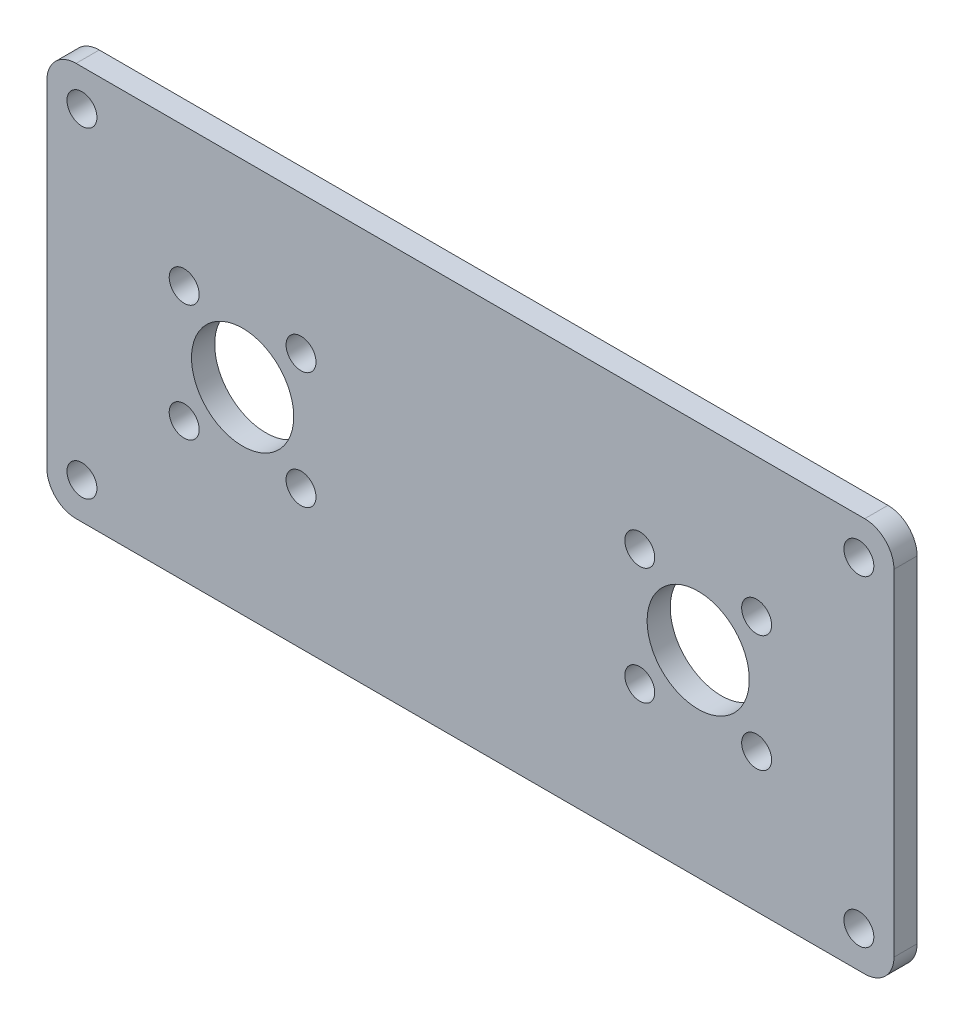
ISO-10303-21;
HEADER;
FILE_DESCRIPTION(('STEP AP214'),'2;1');
FILE_NAME('part.step','',(''),(''),'','','');
FILE_SCHEMA(('AUTOMOTIVE_DESIGN { 1 0 10303 214 1 1 1 1 }'));
ENDSEC;
DATA;
#1=APPLICATION_CONTEXT('core data for automotive mechanical design processes');
#2=APPLICATION_PROTOCOL_DEFINITION('international standard','automotive_design',2000,#1);
#3=PRODUCT_CONTEXT('',#1,'mechanical');
#4=PRODUCT('Part','Part','',(#3));
#5=PRODUCT_RELATED_PRODUCT_CATEGORY('part','',(#4));
#6=PRODUCT_DEFINITION_FORMATION('','',#4);
#7=PRODUCT_DEFINITION_CONTEXT('part definition',#1,'design');
#8=PRODUCT_DEFINITION('design','',#6,#7);
#9=PRODUCT_DEFINITION_SHAPE('','',#8);
#10=(LENGTH_UNIT() NAMED_UNIT(*) SI_UNIT(.MILLI.,.METRE.));
#11=(NAMED_UNIT(*) PLANE_ANGLE_UNIT() SI_UNIT($,.RADIAN.));
#12=(NAMED_UNIT(*) SI_UNIT($,.STERADIAN.) SOLID_ANGLE_UNIT());
#13=UNCERTAINTY_MEASURE_WITH_UNIT(LENGTH_MEASURE(1.E-05),#10,'distance_accuracy_value','');
#14=(GEOMETRIC_REPRESENTATION_CONTEXT(3) GLOBAL_UNCERTAINTY_ASSIGNED_CONTEXT((#13)) GLOBAL_UNIT_ASSIGNED_CONTEXT((#10,
#11,#12)) REPRESENTATION_CONTEXT('',''));
#15=CARTESIAN_POINT('',(0.,0.,0.));
#16=DIRECTION('',(0.,0.,1.));
#17=DIRECTION('',(1.,0.,0.));
#18=AXIS2_PLACEMENT_3D('',#15,#16,#17);
#19=CARTESIAN_POINT('',(0.,0.,3.175));
#20=DIRECTION('',(0.,0.,1.));
#21=DIRECTION('',(1.,0.,0.));
#22=AXIS2_PLACEMENT_3D('',#19,#20,#21);
#23=PLANE('',#22);
#24=CARTESIAN_POINT('',(31.195,0.,3.175));
#25=DIRECTION('',(0.,0.,1.));
#26=DIRECTION('',(-1.,0.,0.));
#27=AXIS2_PLACEMENT_3D('',#24,#25,#26);
#28=CIRCLE('',#27,7.);
#29=CARTESIAN_POINT('',(24.195,0.,3.175));
#30=VERTEX_POINT('',#29);
#31=EDGE_CURVE('E246',#30,#30,#28,.T.);
#32=ORIENTED_EDGE('',*,*,#31,.F.);
#33=EDGE_LOOP('',(#32));
#34=FACE_BOUND('',#33,.T.);
#35=CARTESIAN_POINT('',(39.1950000000001,8.00000000000001,3.175));
#36=DIRECTION('',(0.,0.,1.));
#37=DIRECTION('',(-1.,0.,0.));
#38=AXIS2_PLACEMENT_3D('',#35,#36,#37);
#39=CIRCLE('',#38,2.05);
#40=CARTESIAN_POINT('',(37.145,8.00000000000001,3.175));
#41=VERTEX_POINT('',#40);
#42=EDGE_CURVE('E234',#41,#41,#39,.T.);
#43=ORIENTED_EDGE('',*,*,#42,.F.);
#44=EDGE_LOOP('',(#43));
#45=FACE_BOUND('',#44,.T.);
#46=CARTESIAN_POINT('',(-31.195,0.,3.175));
#47=DIRECTION('',(0.,0.,1.));
#48=DIRECTION('',(1.,0.,0.));
#49=AXIS2_PLACEMENT_3D('',#46,#47,#48);
#50=CIRCLE('',#49,7.);
#51=CARTESIAN_POINT('',(-24.195,0.,3.175));
#52=VERTEX_POINT('',#51);
#53=EDGE_CURVE('E222',#52,#52,#50,.T.);
#54=ORIENTED_EDGE('',*,*,#53,.F.);
#55=EDGE_LOOP('',(#54));
#56=FACE_BOUND('',#55,.T.);
#57=CARTESIAN_POINT('',(-23.195,-8.00000000000001,3.175));
#58=DIRECTION('',(0.,0.,1.));
#59=DIRECTION('',(1.,0.,0.));
#60=AXIS2_PLACEMENT_3D('',#57,#58,#59);
#61=CIRCLE('',#60,2.05);
#62=CARTESIAN_POINT('',(-21.145,-8.00000000000001,3.175));
#63=VERTEX_POINT('',#62);
#64=EDGE_CURVE('E210',#63,#63,#61,.T.);
#65=ORIENTED_EDGE('',*,*,#64,.F.);
#66=EDGE_LOOP('',(#65));
#67=FACE_BOUND('',#66,.T.);
#68=CARTESIAN_POINT('',(-39.195,7.99999999999999,3.175));
#69=DIRECTION('',(0.,0.,1.));
#70=DIRECTION('',(1.,0.,0.));
#71=AXIS2_PLACEMENT_3D('',#68,#69,#70);
#72=CIRCLE('',#71,2.05);
#73=CARTESIAN_POINT('',(-37.145,7.99999999999999,3.175));
#74=VERTEX_POINT('',#73);
#75=EDGE_CURVE('E198',#74,#74,#72,.T.);
#76=ORIENTED_EDGE('',*,*,#75,.F.);
#77=EDGE_LOOP('',(#76));
#78=FACE_BOUND('',#77,.T.);
#79=CARTESIAN_POINT('',(53.195,-22.,3.175));
#80=DIRECTION('',(0.,0.,1.));
#81=DIRECTION('',(1.,0.,0.));
#82=AXIS2_PLACEMENT_3D('',#79,#80,#81);
#83=CIRCLE('',#82,2.05);
#84=CARTESIAN_POINT('',(55.245,-22.,3.175));
#85=VERTEX_POINT('',#84);
#86=EDGE_CURVE('E186',#85,#85,#83,.T.);
#87=ORIENTED_EDGE('',*,*,#86,.F.);
#88=EDGE_LOOP('',(#87));
#89=FACE_BOUND('',#88,.T.);
#90=CARTESIAN_POINT('',(-53.195,22.,3.175));
#91=DIRECTION('',(0.,0.,1.));
#92=DIRECTION('',(1.,0.,0.));
#93=AXIS2_PLACEMENT_3D('',#90,#91,#92);
#94=CIRCLE('',#93,2.04999999999999);
#95=CARTESIAN_POINT('',(-51.145,22.,3.175));
#96=VERTEX_POINT('',#95);
#97=EDGE_CURVE('E132',#96,#96,#94,.T.);
#98=ORIENTED_EDGE('',*,*,#97,.F.);
#99=EDGE_LOOP('',(#98));
#100=FACE_BOUND('',#99,.T.);
#101=DIRECTION('',(0.,-1.,0.));
#102=VECTOR('',#101,1.);
#103=CARTESIAN_POINT('',(-58.,-27.,3.175));
#104=LINE('',#103,#102);
#105=CARTESIAN_POINT('',(-58.,23.,3.175));
#106=VERTEX_POINT('',#105);
#107=CARTESIAN_POINT('',(-58.,-23.,3.175));
#108=VERTEX_POINT('',#107);
#109=EDGE_CURVE('E137',#106,#108,#104,.T.);
#110=ORIENTED_EDGE('',*,*,#109,.T.);
#111=CARTESIAN_POINT('',(-54.,-23.,3.175));
#112=DIRECTION('',(0.,0.,1.));
#113=DIRECTION('',(1.,0.,0.));
#114=AXIS2_PLACEMENT_3D('',#111,#112,#113);
#115=CIRCLE('',#114,4.);
#116=CARTESIAN_POINT('',(-54.,-27.,3.175));
#117=VERTEX_POINT('',#116);
#118=EDGE_CURVE('E152',#108,#117,#115,.T.);
#119=ORIENTED_EDGE('',*,*,#118,.T.);
#120=DIRECTION('',(1.,0.,0.));
#121=VECTOR('',#120,1.);
#122=CARTESIAN_POINT('',(58.,-27.,3.175));
#123=LINE('',#122,#121);
#124=CARTESIAN_POINT('',(54.,-27.,3.175));
#125=VERTEX_POINT('',#124);
#126=EDGE_CURVE('E119',#117,#125,#123,.T.);
#127=ORIENTED_EDGE('',*,*,#126,.T.);
#128=CARTESIAN_POINT('',(54.,-23.,3.175));
#129=DIRECTION('',(0.,0.,1.));
#130=DIRECTION('',(1.,0.,0.));
#131=AXIS2_PLACEMENT_3D('',#128,#129,#130);
#132=CIRCLE('',#131,4.);
#133=CARTESIAN_POINT('',(58.,-23.,3.175));
#134=VERTEX_POINT('',#133);
#135=EDGE_CURVE('E150',#125,#134,#132,.T.);
#136=ORIENTED_EDGE('',*,*,#135,.T.);
#137=DIRECTION('',(0.,1.,0.));
#138=VECTOR('',#137,1.);
#139=CARTESIAN_POINT('',(58.,-27.,3.175));
#140=LINE('',#139,#138);
#141=CARTESIAN_POINT('',(58.,23.,3.175));
#142=VERTEX_POINT('',#141);
#143=EDGE_CURVE('E163',#134,#142,#140,.T.);
#144=ORIENTED_EDGE('',*,*,#143,.T.);
#145=CARTESIAN_POINT('',(54.,23.,3.175));
#146=DIRECTION('',(0.,0.,1.));
#147=DIRECTION('',(1.,0.,0.));
#148=AXIS2_PLACEMENT_3D('',#145,#146,#147);
#149=CIRCLE('',#148,4.);
#150=CARTESIAN_POINT('',(54.,27.,3.175));
#151=VERTEX_POINT('',#150);
#152=EDGE_CURVE('E54',#142,#151,#149,.T.);
#153=ORIENTED_EDGE('',*,*,#152,.T.);
#154=DIRECTION('',(-1.,0.,0.));
#155=VECTOR('',#154,1.);
#156=CARTESIAN_POINT('',(58.,27.,3.175));
#157=LINE('',#156,#155);
#158=CARTESIAN_POINT('',(-54.,27.,3.175));
#159=VERTEX_POINT('',#158);
#160=EDGE_CURVE('E138',#151,#159,#157,.T.);
#161=ORIENTED_EDGE('',*,*,#160,.T.);
#162=CARTESIAN_POINT('',(-54.,23.,3.175));
#163=DIRECTION('',(0.,0.,1.));
#164=DIRECTION('',(1.,0.,0.));
#165=AXIS2_PLACEMENT_3D('',#162,#163,#164);
#166=CIRCLE('',#165,4.);
#167=EDGE_CURVE('E147',#159,#106,#166,.T.);
#168=ORIENTED_EDGE('',*,*,#167,.T.);
#169=EDGE_LOOP('',(#110,#119,#127,#136,#144,#153,#161,#168));
#170=FACE_BOUND('',#169,.T.);
#171=CARTESIAN_POINT('',(53.195,22.,3.175));
#172=DIRECTION('',(0.,0.,1.));
#173=DIRECTION('',(1.,0.,0.));
#174=AXIS2_PLACEMENT_3D('',#171,#172,#173);
#175=CIRCLE('',#174,2.04999999999999);
#176=CARTESIAN_POINT('',(55.245,22.,3.175));
#177=VERTEX_POINT('',#176);
#178=EDGE_CURVE('E180',#177,#177,#175,.T.);
#179=ORIENTED_EDGE('',*,*,#178,.F.);
#180=EDGE_LOOP('',(#179));
#181=FACE_BOUND('',#180,.T.);
#182=CARTESIAN_POINT('',(-53.195,-22.,3.175));
#183=DIRECTION('',(0.,0.,1.));
#184=DIRECTION('',(1.,0.,0.));
#185=AXIS2_PLACEMENT_3D('',#182,#183,#184);
#186=CIRCLE('',#185,2.05);
#187=CARTESIAN_POINT('',(-51.145,-22.,3.175));
#188=VERTEX_POINT('',#187);
#189=EDGE_CURVE('E192',#188,#188,#186,.T.);
#190=ORIENTED_EDGE('',*,*,#189,.F.);
#191=EDGE_LOOP('',(#190));
#192=FACE_BOUND('',#191,.T.);
#193=CARTESIAN_POINT('',(-23.195,8.,3.175));
#194=DIRECTION('',(0.,0.,1.));
#195=DIRECTION('',(1.,0.,0.));
#196=AXIS2_PLACEMENT_3D('',#193,#194,#195);
#197=CIRCLE('',#196,2.05);
#198=CARTESIAN_POINT('',(-21.145,8.,3.175));
#199=VERTEX_POINT('',#198);
#200=EDGE_CURVE('E204',#199,#199,#197,.T.);
#201=ORIENTED_EDGE('',*,*,#200,.F.);
#202=EDGE_LOOP('',(#201));
#203=FACE_BOUND('',#202,.T.);
#204=CARTESIAN_POINT('',(-39.195,-8.00000000000001,3.175));
#205=DIRECTION('',(0.,0.,1.));
#206=DIRECTION('',(1.,0.,0.));
#207=AXIS2_PLACEMENT_3D('',#204,#205,#206);
#208=CIRCLE('',#207,2.05);
#209=CARTESIAN_POINT('',(-37.145,-8.00000000000001,3.175));
#210=VERTEX_POINT('',#209);
#211=EDGE_CURVE('E216',#210,#210,#208,.T.);
#212=ORIENTED_EDGE('',*,*,#211,.F.);
#213=EDGE_LOOP('',(#212));
#214=FACE_BOUND('',#213,.T.);
#215=CARTESIAN_POINT('',(39.195,-7.99999999999999,3.175));
#216=DIRECTION('',(0.,0.,1.));
#217=DIRECTION('',(-1.,0.,0.));
#218=AXIS2_PLACEMENT_3D('',#215,#216,#217);
#219=CIRCLE('',#218,2.05);
#220=CARTESIAN_POINT('',(37.145,-7.99999999999999,3.175));
#221=VERTEX_POINT('',#220);
#222=EDGE_CURVE('E228',#221,#221,#219,.T.);
#223=ORIENTED_EDGE('',*,*,#222,.F.);
#224=EDGE_LOOP('',(#223));
#225=FACE_BOUND('',#224,.T.);
#226=CARTESIAN_POINT('',(23.195,8.,3.175));
#227=DIRECTION('',(0.,0.,1.));
#228=DIRECTION('',(-1.,0.,0.));
#229=AXIS2_PLACEMENT_3D('',#226,#227,#228);
#230=CIRCLE('',#229,2.05);
#231=CARTESIAN_POINT('',(21.145,8.,3.175));
#232=VERTEX_POINT('',#231);
#233=EDGE_CURVE('E240',#232,#232,#230,.T.);
#234=ORIENTED_EDGE('',*,*,#233,.F.);
#235=EDGE_LOOP('',(#234));
#236=FACE_BOUND('',#235,.T.);
#237=CARTESIAN_POINT('',(23.195,-8.,3.175));
#238=DIRECTION('',(0.,0.,1.));
#239=DIRECTION('',(-1.,0.,0.));
#240=AXIS2_PLACEMENT_3D('',#237,#238,#239);
#241=CIRCLE('',#240,2.05);
#242=CARTESIAN_POINT('',(21.145,-8.,3.175));
#243=VERTEX_POINT('',#242);
#244=EDGE_CURVE('E252',#243,#243,#241,.T.);
#245=ORIENTED_EDGE('',*,*,#244,.F.);
#246=EDGE_LOOP('',(#245));
#247=FACE_BOUND('',#246,.T.);
#248=ADVANCED_FACE('F33',(#34,#45,#56,#67,#78,#89,#100,#170,#181,#192,#203,#214,#225,#236,#247),
#23,.T.);
#249=CARTESIAN_POINT('',(0.,0.,0.));
#250=DIRECTION('',(0.,0.,1.));
#251=DIRECTION('',(1.,0.,0.));
#252=AXIS2_PLACEMENT_3D('',#249,#250,#251);
#253=PLANE('',#252);
#254=DIRECTION('',(1.,0.,0.));
#255=VECTOR('',#254,1.);
#256=CARTESIAN_POINT('',(58.,-27.,0.));
#257=LINE('',#256,#255);
#258=CARTESIAN_POINT('',(-54.,-27.,0.));
#259=VERTEX_POINT('',#258);
#260=CARTESIAN_POINT('',(54.,-27.,0.));
#261=VERTEX_POINT('',#260);
#262=EDGE_CURVE('E116',#259,#261,#257,.T.);
#263=ORIENTED_EDGE('',*,*,#262,.F.);
#264=CARTESIAN_POINT('',(-54.,-23.,0.));
#265=DIRECTION('',(0.,0.,1.));
#266=DIRECTION('',(1.,0.,0.));
#267=AXIS2_PLACEMENT_3D('',#264,#265,#266);
#268=CIRCLE('',#267,4.);
#269=CARTESIAN_POINT('',(-58.,-23.,0.));
#270=VERTEX_POINT('',#269);
#271=EDGE_CURVE('E99',#259,#270,#268,.F.);
#272=ORIENTED_EDGE('',*,*,#271,.T.);
#273=DIRECTION('',(0.,-1.,0.));
#274=VECTOR('',#273,1.);
#275=CARTESIAN_POINT('',(-58.,-27.,0.));
#276=LINE('',#275,#274);
#277=CARTESIAN_POINT('',(-58.,23.,0.));
#278=VERTEX_POINT('',#277);
#279=EDGE_CURVE('E127',#278,#270,#276,.T.);
#280=ORIENTED_EDGE('',*,*,#279,.F.);
#281=CARTESIAN_POINT('',(-54.,23.,0.));
#282=DIRECTION('',(0.,0.,1.));
#283=DIRECTION('',(1.,0.,0.));
#284=AXIS2_PLACEMENT_3D('',#281,#282,#283);
#285=CIRCLE('',#284,4.);
#286=CARTESIAN_POINT('',(-54.,27.,0.));
#287=VERTEX_POINT('',#286);
#288=EDGE_CURVE('E120',#278,#287,#285,.F.);
#289=ORIENTED_EDGE('',*,*,#288,.T.);
#290=DIRECTION('',(-1.,0.,0.));
#291=VECTOR('',#290,1.);
#292=CARTESIAN_POINT('',(58.,27.,0.));
#293=LINE('',#292,#291);
#294=CARTESIAN_POINT('',(54.,27.,0.));
#295=VERTEX_POINT('',#294);
#296=EDGE_CURVE('E130',#295,#287,#293,.T.);
#297=ORIENTED_EDGE('',*,*,#296,.F.);
#298=CARTESIAN_POINT('',(54.,23.,0.));
#299=DIRECTION('',(0.,0.,1.));
#300=DIRECTION('',(1.,0.,0.));
#301=AXIS2_PLACEMENT_3D('',#298,#299,#300);
#302=CIRCLE('',#301,4.);
#303=CARTESIAN_POINT('',(58.,23.,0.));
#304=VERTEX_POINT('',#303);
#305=EDGE_CURVE('E141',#295,#304,#302,.F.);
#306=ORIENTED_EDGE('',*,*,#305,.T.);
#307=DIRECTION('',(0.,1.,0.));
#308=VECTOR('',#307,1.);
#309=CARTESIAN_POINT('',(58.,-27.,0.));
#310=LINE('',#309,#308);
#311=CARTESIAN_POINT('',(58.,-23.,0.));
#312=VERTEX_POINT('',#311);
#313=EDGE_CURVE('E126',#312,#304,#310,.T.);
#314=ORIENTED_EDGE('',*,*,#313,.F.);
#315=CARTESIAN_POINT('',(54.,-23.,0.));
#316=DIRECTION('',(0.,0.,1.));
#317=DIRECTION('',(1.,0.,0.));
#318=AXIS2_PLACEMENT_3D('',#315,#316,#317);
#319=CIRCLE('',#318,4.);
#320=EDGE_CURVE('E110',#312,#261,#319,.F.);
#321=ORIENTED_EDGE('',*,*,#320,.T.);
#322=EDGE_LOOP('',(#263,#272,#280,#289,#297,#306,#314,#321));
#323=FACE_BOUND('',#322,.T.);
#324=CARTESIAN_POINT('',(-53.195,22.,0.));
#325=DIRECTION('',(0.,0.,1.));
#326=DIRECTION('',(1.,0.,0.));
#327=AXIS2_PLACEMENT_3D('',#324,#325,#326);
#328=CIRCLE('',#327,2.04999999999999);
#329=CARTESIAN_POINT('',(-51.145,22.,0.));
#330=VERTEX_POINT('',#329);
#331=EDGE_CURVE('E177',#330,#330,#328,.T.);
#332=ORIENTED_EDGE('',*,*,#331,.T.);
#333=EDGE_LOOP('',(#332));
#334=FACE_BOUND('',#333,.T.);
#335=CARTESIAN_POINT('',(53.195,22.,0.));
#336=DIRECTION('',(0.,0.,1.));
#337=DIRECTION('',(1.,0.,0.));
#338=AXIS2_PLACEMENT_3D('',#335,#336,#337);
#339=CIRCLE('',#338,2.04999999999999);
#340=CARTESIAN_POINT('',(55.245,22.,0.));
#341=VERTEX_POINT('',#340);
#342=EDGE_CURVE('E183',#341,#341,#339,.T.);
#343=ORIENTED_EDGE('',*,*,#342,.T.);
#344=EDGE_LOOP('',(#343));
#345=FACE_BOUND('',#344,.T.);
#346=CARTESIAN_POINT('',(53.195,-22.,0.));
#347=DIRECTION('',(0.,0.,1.));
#348=DIRECTION('',(1.,0.,0.));
#349=AXIS2_PLACEMENT_3D('',#346,#347,#348);
#350=CIRCLE('',#349,2.05);
#351=CARTESIAN_POINT('',(55.245,-22.,0.));
#352=VERTEX_POINT('',#351);
#353=EDGE_CURVE('E189',#352,#352,#350,.T.);
#354=ORIENTED_EDGE('',*,*,#353,.T.);
#355=EDGE_LOOP('',(#354));
#356=FACE_BOUND('',#355,.T.);
#357=CARTESIAN_POINT('',(-53.195,-22.,0.));
#358=DIRECTION('',(0.,0.,1.));
#359=DIRECTION('',(1.,0.,0.));
#360=AXIS2_PLACEMENT_3D('',#357,#358,#359);
#361=CIRCLE('',#360,2.05);
#362=CARTESIAN_POINT('',(-51.145,-22.,0.));
#363=VERTEX_POINT('',#362);
#364=EDGE_CURVE('E195',#363,#363,#361,.T.);
#365=ORIENTED_EDGE('',*,*,#364,.T.);
#366=EDGE_LOOP('',(#365));
#367=FACE_BOUND('',#366,.T.);
#368=CARTESIAN_POINT('',(-39.195,7.99999999999999,0.));
#369=DIRECTION('',(0.,0.,1.));
#370=DIRECTION('',(1.,0.,0.));
#371=AXIS2_PLACEMENT_3D('',#368,#369,#370);
#372=CIRCLE('',#371,2.05);
#373=CARTESIAN_POINT('',(-37.145,7.99999999999999,0.));
#374=VERTEX_POINT('',#373);
#375=EDGE_CURVE('E201',#374,#374,#372,.T.);
#376=ORIENTED_EDGE('',*,*,#375,.T.);
#377=EDGE_LOOP('',(#376));
#378=FACE_BOUND('',#377,.T.);
#379=CARTESIAN_POINT('',(-23.195,8.,0.));
#380=DIRECTION('',(0.,0.,1.));
#381=DIRECTION('',(1.,0.,0.));
#382=AXIS2_PLACEMENT_3D('',#379,#380,#381);
#383=CIRCLE('',#382,2.05);
#384=CARTESIAN_POINT('',(-21.145,8.,0.));
#385=VERTEX_POINT('',#384);
#386=EDGE_CURVE('E207',#385,#385,#383,.T.);
#387=ORIENTED_EDGE('',*,*,#386,.T.);
#388=EDGE_LOOP('',(#387));
#389=FACE_BOUND('',#388,.T.);
#390=CARTESIAN_POINT('',(-23.195,-8.00000000000001,0.));
#391=DIRECTION('',(0.,0.,1.));
#392=DIRECTION('',(1.,0.,0.));
#393=AXIS2_PLACEMENT_3D('',#390,#391,#392);
#394=CIRCLE('',#393,2.05);
#395=CARTESIAN_POINT('',(-21.145,-8.00000000000001,0.));
#396=VERTEX_POINT('',#395);
#397=EDGE_CURVE('E213',#396,#396,#394,.T.);
#398=ORIENTED_EDGE('',*,*,#397,.T.);
#399=EDGE_LOOP('',(#398));
#400=FACE_BOUND('',#399,.T.);
#401=CARTESIAN_POINT('',(-39.195,-8.00000000000001,0.));
#402=DIRECTION('',(0.,0.,1.));
#403=DIRECTION('',(1.,0.,0.));
#404=AXIS2_PLACEMENT_3D('',#401,#402,#403);
#405=CIRCLE('',#404,2.05);
#406=CARTESIAN_POINT('',(-37.145,-8.00000000000001,0.));
#407=VERTEX_POINT('',#406);
#408=EDGE_CURVE('E219',#407,#407,#405,.T.);
#409=ORIENTED_EDGE('',*,*,#408,.T.);
#410=EDGE_LOOP('',(#409));
#411=FACE_BOUND('',#410,.T.);
#412=CARTESIAN_POINT('',(-31.195,0.,0.));
#413=DIRECTION('',(0.,0.,1.));
#414=DIRECTION('',(1.,0.,0.));
#415=AXIS2_PLACEMENT_3D('',#412,#413,#414);
#416=CIRCLE('',#415,7.);
#417=CARTESIAN_POINT('',(-24.195,0.,0.));
#418=VERTEX_POINT('',#417);
#419=EDGE_CURVE('E225',#418,#418,#416,.T.);
#420=ORIENTED_EDGE('',*,*,#419,.T.);
#421=EDGE_LOOP('',(#420));
#422=FACE_BOUND('',#421,.T.);
#423=CARTESIAN_POINT('',(39.195,-7.99999999999999,0.));
#424=DIRECTION('',(0.,0.,1.));
#425=DIRECTION('',(-1.,0.,0.));
#426=AXIS2_PLACEMENT_3D('',#423,#424,#425);
#427=CIRCLE('',#426,2.05);
#428=CARTESIAN_POINT('',(37.145,-7.99999999999999,0.));
#429=VERTEX_POINT('',#428);
#430=EDGE_CURVE('E231',#429,#429,#427,.T.);
#431=ORIENTED_EDGE('',*,*,#430,.T.);
#432=EDGE_LOOP('',(#431));
#433=FACE_BOUND('',#432,.T.);
#434=CARTESIAN_POINT('',(39.1950000000001,8.00000000000001,0.));
#435=DIRECTION('',(0.,0.,1.));
#436=DIRECTION('',(-1.,0.,0.));
#437=AXIS2_PLACEMENT_3D('',#434,#435,#436);
#438=CIRCLE('',#437,2.05);
#439=CARTESIAN_POINT('',(37.145,8.00000000000001,0.));
#440=VERTEX_POINT('',#439);
#441=EDGE_CURVE('E237',#440,#440,#438,.T.);
#442=ORIENTED_EDGE('',*,*,#441,.T.);
#443=EDGE_LOOP('',(#442));
#444=FACE_BOUND('',#443,.T.);
#445=CARTESIAN_POINT('',(23.195,8.,0.));
#446=DIRECTION('',(0.,0.,1.));
#447=DIRECTION('',(-1.,0.,0.));
#448=AXIS2_PLACEMENT_3D('',#445,#446,#447);
#449=CIRCLE('',#448,2.05);
#450=CARTESIAN_POINT('',(21.145,8.,0.));
#451=VERTEX_POINT('',#450);
#452=EDGE_CURVE('E243',#451,#451,#449,.T.);
#453=ORIENTED_EDGE('',*,*,#452,.T.);
#454=EDGE_LOOP('',(#453));
#455=FACE_BOUND('',#454,.T.);
#456=CARTESIAN_POINT('',(31.195,0.,0.));
#457=DIRECTION('',(0.,0.,1.));
#458=DIRECTION('',(-1.,0.,0.));
#459=AXIS2_PLACEMENT_3D('',#456,#457,#458);
#460=CIRCLE('',#459,7.);
#461=CARTESIAN_POINT('',(24.195,0.,0.));
#462=VERTEX_POINT('',#461);
#463=EDGE_CURVE('E249',#462,#462,#460,.T.);
#464=ORIENTED_EDGE('',*,*,#463,.T.);
#465=EDGE_LOOP('',(#464));
#466=FACE_BOUND('',#465,.T.);
#467=CARTESIAN_POINT('',(23.195,-8.,0.));
#468=DIRECTION('',(0.,0.,1.));
#469=DIRECTION('',(-1.,0.,0.));
#470=AXIS2_PLACEMENT_3D('',#467,#468,#469);
#471=CIRCLE('',#470,2.05);
#472=CARTESIAN_POINT('',(21.145,-8.,0.));
#473=VERTEX_POINT('',#472);
#474=EDGE_CURVE('E255',#473,#473,#471,.T.);
#475=ORIENTED_EDGE('',*,*,#474,.T.);
#476=EDGE_LOOP('',(#475));
#477=FACE_BOUND('',#476,.T.);
#478=ADVANCED_FACE('F123',(#323,#334,#345,#356,#367,#378,#389,#400,#411,#422,#433,#444,#455,
#466,#477),#253,.F.);
#479=CARTESIAN_POINT('',(-58.,-27.,3.175));
#480=DIRECTION('',(1.,0.,0.));
#481=DIRECTION('',(0.,0.,-1.));
#482=AXIS2_PLACEMENT_3D('',#479,#480,#481);
#483=PLANE('',#482);
#484=ORIENTED_EDGE('',*,*,#279,.T.);
#485=DIRECTION('',(0.,0.,-1.));
#486=VECTOR('',#485,1.);
#487=CARTESIAN_POINT('',(-58.,-23.,3.175));
#488=LINE('',#487,#486);
#489=EDGE_CURVE('E104',#270,#108,#488,.F.);
#490=ORIENTED_EDGE('',*,*,#489,.T.);
#491=ORIENTED_EDGE('',*,*,#109,.F.);
#492=DIRECTION('',(0.,0.,-1.));
#493=VECTOR('',#492,1.);
#494=CARTESIAN_POINT('',(-58.,23.,3.175));
#495=LINE('',#494,#493);
#496=EDGE_CURVE('E109',#106,#278,#495,.T.);
#497=ORIENTED_EDGE('',*,*,#496,.T.);
#498=EDGE_LOOP('',(#484,#490,#491,#497));
#499=FACE_BOUND('',#498,.T.);
#500=ADVANCED_FACE('F270',(#499),#483,.F.);
#501=CARTESIAN_POINT('',(58.,-27.,3.175));
#502=DIRECTION('',(0.,1.,0.));
#503=DIRECTION('',(-1.,0.,0.));
#504=AXIS2_PLACEMENT_3D('',#501,#502,#503);
#505=PLANE('',#504);
#506=ORIENTED_EDGE('',*,*,#126,.F.);
#507=DIRECTION('',(0.,0.,-1.));
#508=VECTOR('',#507,1.);
#509=CARTESIAN_POINT('',(-54.,-27.,3.175));
#510=LINE('',#509,#508);
#511=EDGE_CURVE('E103',#117,#259,#510,.T.);
#512=ORIENTED_EDGE('',*,*,#511,.T.);
#513=ORIENTED_EDGE('',*,*,#262,.T.);
#514=DIRECTION('',(0.,0.,-1.));
#515=VECTOR('',#514,1.);
#516=CARTESIAN_POINT('',(54.,-27.,3.175));
#517=LINE('',#516,#515);
#518=EDGE_CURVE('E121',#261,#125,#517,.F.);
#519=ORIENTED_EDGE('',*,*,#518,.T.);
#520=EDGE_LOOP('',(#506,#512,#513,#519));
#521=FACE_BOUND('',#520,.T.);
#522=ADVANCED_FACE('F115',(#521),#505,.F.);
#523=CARTESIAN_POINT('',(58.,-27.,3.175));
#524=DIRECTION('',(-1.,0.,0.));
#525=DIRECTION('',(0.,0.,1.));
#526=AXIS2_PLACEMENT_3D('',#523,#524,#525);
#527=PLANE('',#526);
#528=ORIENTED_EDGE('',*,*,#143,.F.);
#529=DIRECTION('',(0.,0.,-1.));
#530=VECTOR('',#529,1.);
#531=CARTESIAN_POINT('',(58.,-23.,3.175));
#532=LINE('',#531,#530);
#533=EDGE_CURVE('E156',#134,#312,#532,.T.);
#534=ORIENTED_EDGE('',*,*,#533,.T.);
#535=ORIENTED_EDGE('',*,*,#313,.T.);
#536=DIRECTION('',(0.,0.,-1.));
#537=VECTOR('',#536,1.);
#538=CARTESIAN_POINT('',(58.,23.,3.175));
#539=LINE('',#538,#537);
#540=EDGE_CURVE('E154',#304,#142,#539,.F.);
#541=ORIENTED_EDGE('',*,*,#540,.T.);
#542=EDGE_LOOP('',(#528,#534,#535,#541));
#543=FACE_BOUND('',#542,.T.);
#544=ADVANCED_FACE('F161',(#543),#527,.F.);
#545=CARTESIAN_POINT('',(58.,27.,3.175));
#546=DIRECTION('',(0.,-1.,0.));
#547=DIRECTION('',(1.,0.,0.));
#548=AXIS2_PLACEMENT_3D('',#545,#546,#547);
#549=PLANE('',#548);
#550=ORIENTED_EDGE('',*,*,#160,.F.);
#551=DIRECTION('',(0.,0.,-1.));
#552=VECTOR('',#551,1.);
#553=CARTESIAN_POINT('',(54.,27.,3.175));
#554=LINE('',#553,#552);
#555=EDGE_CURVE('E11',#151,#295,#554,.T.);
#556=ORIENTED_EDGE('',*,*,#555,.T.);
#557=ORIENTED_EDGE('',*,*,#296,.T.);
#558=DIRECTION('',(0.,0.,-1.));
#559=VECTOR('',#558,1.);
#560=CARTESIAN_POINT('',(-54.,27.,3.175));
#561=LINE('',#560,#559);
#562=EDGE_CURVE('E41',#287,#159,#561,.F.);
#563=ORIENTED_EDGE('',*,*,#562,.T.);
#564=EDGE_LOOP('',(#550,#556,#557,#563));
#565=FACE_BOUND('',#564,.T.);
#566=ADVANCED_FACE('F170',(#565),#549,.F.);
#567=CARTESIAN_POINT('',(-53.195,22.,3.175));
#568=DIRECTION('',(0.,0.,-1.));
#569=DIRECTION('',(-1.,0.,0.));
#570=AXIS2_PLACEMENT_3D('',#567,#568,#569);
#571=CYLINDRICAL_SURFACE('',#570,2.04999999999999);
#572=ORIENTED_EDGE('',*,*,#97,.T.);
#573=EDGE_LOOP('',(#572));
#574=FACE_BOUND('',#573,.T.);
#575=ORIENTED_EDGE('',*,*,#331,.F.);
#576=EDGE_LOOP('',(#575));
#577=FACE_BOUND('',#576,.T.);
#578=ADVANCED_FACE('F275',(#574,#577),#571,.F.);
#579=CARTESIAN_POINT('',(53.195,22.,3.175));
#580=DIRECTION('',(0.,0.,-1.));
#581=DIRECTION('',(-1.,0.,0.));
#582=AXIS2_PLACEMENT_3D('',#579,#580,#581);
#583=CYLINDRICAL_SURFACE('',#582,2.04999999999999);
#584=ORIENTED_EDGE('',*,*,#178,.T.);
#585=EDGE_LOOP('',(#584));
#586=FACE_BOUND('',#585,.T.);
#587=ORIENTED_EDGE('',*,*,#342,.F.);
#588=EDGE_LOOP('',(#587));
#589=FACE_BOUND('',#588,.T.);
#590=ADVANCED_FACE('F366',(#586,#589),#583,.F.);
#591=CARTESIAN_POINT('',(53.195,-22.,3.175));
#592=DIRECTION('',(0.,0.,-1.));
#593=DIRECTION('',(-1.,0.,0.));
#594=AXIS2_PLACEMENT_3D('',#591,#592,#593);
#595=CYLINDRICAL_SURFACE('',#594,2.05);
#596=ORIENTED_EDGE('',*,*,#86,.T.);
#597=EDGE_LOOP('',(#596));
#598=FACE_BOUND('',#597,.T.);
#599=ORIENTED_EDGE('',*,*,#353,.F.);
#600=EDGE_LOOP('',(#599));
#601=FACE_BOUND('',#600,.T.);
#602=ADVANCED_FACE('F363',(#598,#601),#595,.F.);
#603=CARTESIAN_POINT('',(-53.195,-22.,3.175));
#604=DIRECTION('',(0.,0.,-1.));
#605=DIRECTION('',(-1.,0.,0.));
#606=AXIS2_PLACEMENT_3D('',#603,#604,#605);
#607=CYLINDRICAL_SURFACE('',#606,2.05);
#608=ORIENTED_EDGE('',*,*,#189,.T.);
#609=EDGE_LOOP('',(#608));
#610=FACE_BOUND('',#609,.T.);
#611=ORIENTED_EDGE('',*,*,#364,.F.);
#612=EDGE_LOOP('',(#611));
#613=FACE_BOUND('',#612,.T.);
#614=ADVANCED_FACE('F359',(#610,#613),#607,.F.);
#615=CARTESIAN_POINT('',(-39.195,7.99999999999999,3.175));
#616=DIRECTION('',(0.,0.,-1.));
#617=DIRECTION('',(-1.,0.,0.));
#618=AXIS2_PLACEMENT_3D('',#615,#616,#617);
#619=CYLINDRICAL_SURFACE('',#618,2.05);
#620=ORIENTED_EDGE('',*,*,#75,.T.);
#621=EDGE_LOOP('',(#620));
#622=FACE_BOUND('',#621,.T.);
#623=ORIENTED_EDGE('',*,*,#375,.F.);
#624=EDGE_LOOP('',(#623));
#625=FACE_BOUND('',#624,.T.);
#626=ADVANCED_FACE('F355',(#622,#625),#619,.F.);
#627=CARTESIAN_POINT('',(-23.195,8.,3.175));
#628=DIRECTION('',(0.,0.,-1.));
#629=DIRECTION('',(-1.,0.,0.));
#630=AXIS2_PLACEMENT_3D('',#627,#628,#629);
#631=CYLINDRICAL_SURFACE('',#630,2.05);
#632=ORIENTED_EDGE('',*,*,#200,.T.);
#633=EDGE_LOOP('',(#632));
#634=FACE_BOUND('',#633,.T.);
#635=ORIENTED_EDGE('',*,*,#386,.F.);
#636=EDGE_LOOP('',(#635));
#637=FACE_BOUND('',#636,.T.);
#638=ADVANCED_FACE('F351',(#634,#637),#631,.F.);
#639=CARTESIAN_POINT('',(-23.195,-8.00000000000001,3.175));
#640=DIRECTION('',(0.,0.,-1.));
#641=DIRECTION('',(-1.,0.,0.));
#642=AXIS2_PLACEMENT_3D('',#639,#640,#641);
#643=CYLINDRICAL_SURFACE('',#642,2.05);
#644=ORIENTED_EDGE('',*,*,#64,.T.);
#645=EDGE_LOOP('',(#644));
#646=FACE_BOUND('',#645,.T.);
#647=ORIENTED_EDGE('',*,*,#397,.F.);
#648=EDGE_LOOP('',(#647));
#649=FACE_BOUND('',#648,.T.);
#650=ADVANCED_FACE('F347',(#646,#649),#643,.F.);
#651=CARTESIAN_POINT('',(-39.195,-8.00000000000001,3.175));
#652=DIRECTION('',(0.,0.,-1.));
#653=DIRECTION('',(-1.,0.,0.));
#654=AXIS2_PLACEMENT_3D('',#651,#652,#653);
#655=CYLINDRICAL_SURFACE('',#654,2.05);
#656=ORIENTED_EDGE('',*,*,#211,.T.);
#657=EDGE_LOOP('',(#656));
#658=FACE_BOUND('',#657,.T.);
#659=ORIENTED_EDGE('',*,*,#408,.F.);
#660=EDGE_LOOP('',(#659));
#661=FACE_BOUND('',#660,.T.);
#662=ADVANCED_FACE('F343',(#658,#661),#655,.F.);
#663=CARTESIAN_POINT('',(-31.195,0.,3.175));
#664=DIRECTION('',(0.,0.,-1.));
#665=DIRECTION('',(-1.,0.,0.));
#666=AXIS2_PLACEMENT_3D('',#663,#664,#665);
#667=CYLINDRICAL_SURFACE('',#666,7.);
#668=ORIENTED_EDGE('',*,*,#53,.T.);
#669=EDGE_LOOP('',(#668));
#670=FACE_BOUND('',#669,.T.);
#671=ORIENTED_EDGE('',*,*,#419,.F.);
#672=EDGE_LOOP('',(#671));
#673=FACE_BOUND('',#672,.T.);
#674=ADVANCED_FACE('F339',(#670,#673),#667,.F.);
#675=CARTESIAN_POINT('',(39.195,-7.99999999999999,3.175));
#676=DIRECTION('',(0.,0.,-1.));
#677=DIRECTION('',(-1.,0.,0.));
#678=AXIS2_PLACEMENT_3D('',#675,#676,#677);
#679=CYLINDRICAL_SURFACE('',#678,2.05);
#680=ORIENTED_EDGE('',*,*,#222,.T.);
#681=EDGE_LOOP('',(#680));
#682=FACE_BOUND('',#681,.T.);
#683=ORIENTED_EDGE('',*,*,#430,.F.);
#684=EDGE_LOOP('',(#683));
#685=FACE_BOUND('',#684,.T.);
#686=ADVANCED_FACE('F335',(#682,#685),#679,.F.);
#687=CARTESIAN_POINT('',(39.1950000000001,8.00000000000001,3.175));
#688=DIRECTION('',(0.,0.,-1.));
#689=DIRECTION('',(-1.,0.,0.));
#690=AXIS2_PLACEMENT_3D('',#687,#688,#689);
#691=CYLINDRICAL_SURFACE('',#690,2.05);
#692=ORIENTED_EDGE('',*,*,#42,.T.);
#693=EDGE_LOOP('',(#692));
#694=FACE_BOUND('',#693,.T.);
#695=ORIENTED_EDGE('',*,*,#441,.F.);
#696=EDGE_LOOP('',(#695));
#697=FACE_BOUND('',#696,.T.);
#698=ADVANCED_FACE('F317',(#694,#697),#691,.F.);
#699=CARTESIAN_POINT('',(23.195,8.,3.175));
#700=DIRECTION('',(0.,0.,-1.));
#701=DIRECTION('',(-1.,0.,0.));
#702=AXIS2_PLACEMENT_3D('',#699,#700,#701);
#703=CYLINDRICAL_SURFACE('',#702,2.05);
#704=ORIENTED_EDGE('',*,*,#233,.T.);
#705=EDGE_LOOP('',(#704));
#706=FACE_BOUND('',#705,.T.);
#707=ORIENTED_EDGE('',*,*,#452,.F.);
#708=EDGE_LOOP('',(#707));
#709=FACE_BOUND('',#708,.T.);
#710=ADVANCED_FACE('F313',(#706,#709),#703,.F.);
#711=CARTESIAN_POINT('',(31.195,0.,3.175));
#712=DIRECTION('',(0.,0.,-1.));
#713=DIRECTION('',(-1.,0.,0.));
#714=AXIS2_PLACEMENT_3D('',#711,#712,#713);
#715=CYLINDRICAL_SURFACE('',#714,7.);
#716=ORIENTED_EDGE('',*,*,#31,.T.);
#717=EDGE_LOOP('',(#716));
#718=FACE_BOUND('',#717,.T.);
#719=ORIENTED_EDGE('',*,*,#463,.F.);
#720=EDGE_LOOP('',(#719));
#721=FACE_BOUND('',#720,.T.);
#722=ADVANCED_FACE('F316',(#718,#721),#715,.F.);
#723=CARTESIAN_POINT('',(23.195,-8.,3.175));
#724=DIRECTION('',(0.,0.,-1.));
#725=DIRECTION('',(-1.,0.,0.));
#726=AXIS2_PLACEMENT_3D('',#723,#724,#725);
#727=CYLINDRICAL_SURFACE('',#726,2.05);
#728=ORIENTED_EDGE('',*,*,#244,.T.);
#729=EDGE_LOOP('',(#728));
#730=FACE_BOUND('',#729,.T.);
#731=ORIENTED_EDGE('',*,*,#474,.F.);
#732=EDGE_LOOP('',(#731));
#733=FACE_BOUND('',#732,.T.);
#734=ADVANCED_FACE('F261',(#730,#733),#727,.F.);
#735=CARTESIAN_POINT('',(-54.,-23.,3.175));
#736=DIRECTION('',(0.,0.,-1.));
#737=DIRECTION('',(-1.,0.,0.));
#738=AXIS2_PLACEMENT_3D('',#735,#736,#737);
#739=CYLINDRICAL_SURFACE('',#738,4.);
#740=ORIENTED_EDGE('',*,*,#118,.F.);
#741=ORIENTED_EDGE('',*,*,#489,.F.);
#742=ORIENTED_EDGE('',*,*,#271,.F.);
#743=ORIENTED_EDGE('',*,*,#511,.F.);
#744=EDGE_LOOP('',(#740,#741,#742,#743));
#745=FACE_BOUND('',#744,.T.);
#746=ADVANCED_FACE('F102',(#745),#739,.T.);
#747=CARTESIAN_POINT('',(54.,-23.,3.175));
#748=DIRECTION('',(0.,0.,-1.));
#749=DIRECTION('',(-1.,0.,0.));
#750=AXIS2_PLACEMENT_3D('',#747,#748,#749);
#751=CYLINDRICAL_SURFACE('',#750,4.);
#752=ORIENTED_EDGE('',*,*,#135,.F.);
#753=ORIENTED_EDGE('',*,*,#518,.F.);
#754=ORIENTED_EDGE('',*,*,#320,.F.);
#755=ORIENTED_EDGE('',*,*,#533,.F.);
#756=EDGE_LOOP('',(#752,#753,#754,#755));
#757=FACE_BOUND('',#756,.T.);
#758=ADVANCED_FACE('F289',(#757),#751,.T.);
#759=CARTESIAN_POINT('',(54.,23.,3.175));
#760=DIRECTION('',(0.,0.,-1.));
#761=DIRECTION('',(-1.,0.,0.));
#762=AXIS2_PLACEMENT_3D('',#759,#760,#761);
#763=CYLINDRICAL_SURFACE('',#762,4.);
#764=ORIENTED_EDGE('',*,*,#152,.F.);
#765=ORIENTED_EDGE('',*,*,#540,.F.);
#766=ORIENTED_EDGE('',*,*,#305,.F.);
#767=ORIENTED_EDGE('',*,*,#555,.F.);
#768=EDGE_LOOP('',(#764,#765,#766,#767));
#769=FACE_BOUND('',#768,.T.);
#770=ADVANCED_FACE('F169',(#769),#763,.T.);
#771=CARTESIAN_POINT('',(-54.,23.,3.175));
#772=DIRECTION('',(0.,0.,-1.));
#773=DIRECTION('',(-1.,0.,0.));
#774=AXIS2_PLACEMENT_3D('',#771,#772,#773);
#775=CYLINDRICAL_SURFACE('',#774,4.);
#776=ORIENTED_EDGE('',*,*,#167,.F.);
#777=ORIENTED_EDGE('',*,*,#562,.F.);
#778=ORIENTED_EDGE('',*,*,#288,.F.);
#779=ORIENTED_EDGE('',*,*,#496,.F.);
#780=EDGE_LOOP('',(#776,#777,#778,#779));
#781=FACE_BOUND('',#780,.T.);
#782=ADVANCED_FACE('F35',(#781),#775,.T.);
#783=CLOSED_SHELL('',(#248,#478,#500,#522,#544,#566,#578,#590,#602,#614,#626,#638,#650,#662,
#674,#686,#698,#710,#722,#734,#746,#758,#770,#782));
#784=MANIFOLD_SOLID_BREP('B2',#783);
#785=ADVANCED_BREP_SHAPE_REPRESENTATION('',(#18,#784),#14);
#786=SHAPE_DEFINITION_REPRESENTATION(#9,#785);
ENDSEC;
END-ISO-10303-21;
